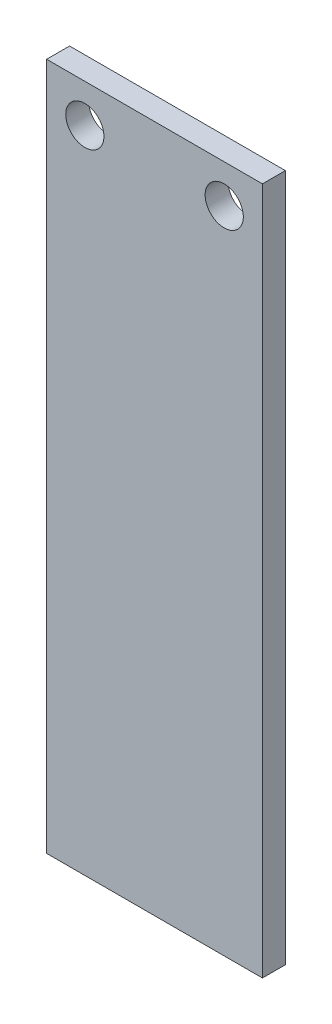
ISO-10303-21;
HEADER;
FILE_DESCRIPTION(('STEP AP214'),'2;1');
FILE_NAME('part.step','',(''),(''),'','','');
FILE_SCHEMA(('AUTOMOTIVE_DESIGN { 1 0 10303 214 1 1 1 1 }'));
ENDSEC;
DATA;
#1=APPLICATION_CONTEXT('core data for automotive mechanical design processes');
#2=APPLICATION_PROTOCOL_DEFINITION('international standard','automotive_design',2000,#1);
#3=PRODUCT_CONTEXT('',#1,'mechanical');
#4=PRODUCT('Part','Part','',(#3));
#5=PRODUCT_RELATED_PRODUCT_CATEGORY('part','',(#4));
#6=PRODUCT_DEFINITION_FORMATION('','',#4);
#7=PRODUCT_DEFINITION_CONTEXT('part definition',#1,'design');
#8=PRODUCT_DEFINITION('design','',#6,#7);
#9=PRODUCT_DEFINITION_SHAPE('','',#8);
#10=(LENGTH_UNIT() NAMED_UNIT(*) SI_UNIT(.MILLI.,.METRE.));
#11=(NAMED_UNIT(*) PLANE_ANGLE_UNIT() SI_UNIT($,.RADIAN.));
#12=(NAMED_UNIT(*) SI_UNIT($,.STERADIAN.) SOLID_ANGLE_UNIT());
#13=UNCERTAINTY_MEASURE_WITH_UNIT(LENGTH_MEASURE(1.E-05),#10,'distance_accuracy_value','');
#14=(GEOMETRIC_REPRESENTATION_CONTEXT(3) GLOBAL_UNCERTAINTY_ASSIGNED_CONTEXT((#13)) GLOBAL_UNIT_ASSIGNED_CONTEXT((#10,
#11,#12)) REPRESENTATION_CONTEXT('',''));
#15=CARTESIAN_POINT('',(0.,0.,0.));
#16=DIRECTION('',(0.,0.,1.));
#17=DIRECTION('',(1.,0.,0.));
#18=AXIS2_PLACEMENT_3D('',#15,#16,#17);
#19=CARTESIAN_POINT('',(14.12,40.,3.));
#20=DIRECTION('',(-1.,0.,0.));
#21=DIRECTION('',(0.,-1.,0.));
#22=AXIS2_PLACEMENT_3D('',#19,#20,#21);
#23=PLANE('',#22);
#24=DIRECTION('',(0.,1.,0.));
#25=VECTOR('',#24,1.);
#26=CARTESIAN_POINT('',(14.12,40.,0.));
#27=LINE('',#26,#25);
#28=CARTESIAN_POINT('',(14.12,-40.,0.));
#29=VERTEX_POINT('',#28);
#30=CARTESIAN_POINT('',(14.12,50.,0.));
#31=VERTEX_POINT('',#30);
#32=EDGE_CURVE('E86',#29,#31,#27,.T.);
#33=ORIENTED_EDGE('',*,*,#32,.T.);
#34=DIRECTION('',(0.,0.,-1.));
#35=VECTOR('',#34,1.);
#36=CARTESIAN_POINT('',(14.12,50.,3.));
#37=LINE('',#36,#35);
#38=CARTESIAN_POINT('',(14.12,50.,3.));
#39=VERTEX_POINT('',#38);
#40=EDGE_CURVE('E88',#39,#31,#37,.T.);
#41=ORIENTED_EDGE('',*,*,#40,.F.);
#42=DIRECTION('',(0.,1.,0.));
#43=VECTOR('',#42,1.);
#44=CARTESIAN_POINT('',(14.12,40.,3.));
#45=LINE('',#44,#43);
#46=CARTESIAN_POINT('',(14.12,-40.,3.));
#47=VERTEX_POINT('',#46);
#48=EDGE_CURVE('E75',#47,#39,#45,.T.);
#49=ORIENTED_EDGE('',*,*,#48,.F.);
#50=DIRECTION('',(0.,0.,-1.));
#51=VECTOR('',#50,1.);
#52=CARTESIAN_POINT('',(14.12,-40.,3.));
#53=LINE('',#52,#51);
#54=EDGE_CURVE('E50',#47,#29,#53,.T.);
#55=ORIENTED_EDGE('',*,*,#54,.T.);
#56=EDGE_LOOP('',(#33,#41,#49,#55));
#57=FACE_BOUND('',#56,.T.);
#58=ADVANCED_FACE('F41',(#57),#23,.F.);
#59=CARTESIAN_POINT('',(-14.12,40.,3.));
#60=DIRECTION('',(1.,0.,0.));
#61=DIRECTION('',(0.,1.,0.));
#62=AXIS2_PLACEMENT_3D('',#59,#60,#61);
#63=PLANE('',#62);
#64=DIRECTION('',(0.,-1.,0.));
#65=VECTOR('',#64,1.);
#66=CARTESIAN_POINT('',(-14.12,40.,0.));
#67=LINE('',#66,#65);
#68=CARTESIAN_POINT('',(-14.12,50.,0.));
#69=VERTEX_POINT('',#68);
#70=CARTESIAN_POINT('',(-14.12,-40.,0.));
#71=VERTEX_POINT('',#70);
#72=EDGE_CURVE('E69',#69,#71,#67,.T.);
#73=ORIENTED_EDGE('',*,*,#72,.T.);
#74=DIRECTION('',(0.,0.,-1.));
#75=VECTOR('',#74,1.);
#76=CARTESIAN_POINT('',(-14.12,-40.,3.));
#77=LINE('',#76,#75);
#78=CARTESIAN_POINT('',(-14.12,-40.,3.));
#79=VERTEX_POINT('',#78);
#80=EDGE_CURVE('E11',#79,#71,#77,.T.);
#81=ORIENTED_EDGE('',*,*,#80,.F.);
#82=DIRECTION('',(0.,-1.,0.));
#83=VECTOR('',#82,1.);
#84=CARTESIAN_POINT('',(-14.12,40.,3.));
#85=LINE('',#84,#83);
#86=CARTESIAN_POINT('',(-14.12,50.,3.));
#87=VERTEX_POINT('',#86);
#88=EDGE_CURVE('E120',#87,#79,#85,.T.);
#89=ORIENTED_EDGE('',*,*,#88,.F.);
#90=DIRECTION('',(0.,0.,-1.));
#91=VECTOR('',#90,1.);
#92=CARTESIAN_POINT('',(-14.12,50.,3.));
#93=LINE('',#92,#91);
#94=EDGE_CURVE('E102',#87,#69,#93,.T.);
#95=ORIENTED_EDGE('',*,*,#94,.T.);
#96=EDGE_LOOP('',(#73,#81,#89,#95));
#97=FACE_BOUND('',#96,.T.);
#98=ADVANCED_FACE('F132',(#97),#63,.F.);
#99=CARTESIAN_POINT('',(-14.12,-40.,3.));
#100=DIRECTION('',(0.,1.,0.));
#101=DIRECTION('',(0.,0.,1.));
#102=AXIS2_PLACEMENT_3D('',#99,#100,#101);
#103=PLANE('',#102);
#104=DIRECTION('',(1.,0.,0.));
#105=VECTOR('',#104,1.);
#106=CARTESIAN_POINT('',(-14.12,-40.,0.));
#107=LINE('',#106,#105);
#108=EDGE_CURVE('E121',#71,#29,#107,.T.);
#109=ORIENTED_EDGE('',*,*,#108,.T.);
#110=ORIENTED_EDGE('',*,*,#54,.F.);
#111=DIRECTION('',(1.,0.,0.));
#112=VECTOR('',#111,1.);
#113=CARTESIAN_POINT('',(-14.12,-40.,3.));
#114=LINE('',#113,#112);
#115=EDGE_CURVE('E58',#79,#47,#114,.T.);
#116=ORIENTED_EDGE('',*,*,#115,.F.);
#117=ORIENTED_EDGE('',*,*,#80,.T.);
#118=EDGE_LOOP('',(#109,#110,#116,#117));
#119=FACE_BOUND('',#118,.T.);
#120=ADVANCED_FACE('F131',(#119),#103,.F.);
#121=CARTESIAN_POINT('',(0.,0.,3.));
#122=DIRECTION('',(0.,0.,1.));
#123=DIRECTION('',(1.,0.,0.));
#124=AXIS2_PLACEMENT_3D('',#121,#122,#123);
#125=PLANE('',#124);
#126=CARTESIAN_POINT('',(9.12,45.,3.));
#127=DIRECTION('',(0.,0.,1.));
#128=DIRECTION('',(1.,0.,0.));
#129=AXIS2_PLACEMENT_3D('',#126,#127,#128);
#130=CIRCLE('',#129,2.5);
#131=CARTESIAN_POINT('',(6.62,45.,3.));
#132=VERTEX_POINT('',#131);
#133=EDGE_CURVE('E218',#132,#132,#130,.T.);
#134=ORIENTED_EDGE('',*,*,#133,.F.);
#135=EDGE_LOOP('',(#134));
#136=FACE_BOUND('',#135,.T.);
#137=CARTESIAN_POINT('',(-9.12,45.,3.));
#138=DIRECTION('',(0.,0.,1.));
#139=DIRECTION('',(1.,0.,0.));
#140=AXIS2_PLACEMENT_3D('',#137,#138,#139);
#141=CIRCLE('',#140,2.5);
#142=CARTESIAN_POINT('',(-11.62,45.,3.));
#143=VERTEX_POINT('',#142);
#144=EDGE_CURVE('E112',#143,#143,#141,.F.);
#145=ORIENTED_EDGE('',*,*,#144,.T.);
#146=EDGE_LOOP('',(#145));
#147=FACE_BOUND('',#146,.T.);
#148=ORIENTED_EDGE('',*,*,#48,.T.);
#149=DIRECTION('',(1.,0.,0.));
#150=VECTOR('',#149,1.);
#151=CARTESIAN_POINT('',(-14.12,50.,3.));
#152=LINE('',#151,#150);
#153=EDGE_CURVE('E100',#87,#39,#152,.T.);
#154=ORIENTED_EDGE('',*,*,#153,.F.);
#155=ORIENTED_EDGE('',*,*,#88,.T.);
#156=ORIENTED_EDGE('',*,*,#115,.T.);
#157=EDGE_LOOP('',(#148,#154,#155,#156));
#158=FACE_BOUND('',#157,.T.);
#159=ADVANCED_FACE('F133',(#136,#147,#158),#125,.T.);
#160=CARTESIAN_POINT('',(0.,0.,0.));
#161=DIRECTION('',(0.,0.,1.));
#162=DIRECTION('',(1.,0.,0.));
#163=AXIS2_PLACEMENT_3D('',#160,#161,#162);
#164=PLANE('',#163);
#165=CARTESIAN_POINT('',(9.12,45.,0.));
#166=DIRECTION('',(0.,0.,1.));
#167=DIRECTION('',(1.,0.,0.));
#168=AXIS2_PLACEMENT_3D('',#165,#166,#167);
#169=CIRCLE('',#168,2.5);
#170=CARTESIAN_POINT('',(6.62,45.,0.));
#171=VERTEX_POINT('',#170);
#172=EDGE_CURVE('E221',#171,#171,#169,.T.);
#173=ORIENTED_EDGE('',*,*,#172,.T.);
#174=EDGE_LOOP('',(#173));
#175=FACE_BOUND('',#174,.T.);
#176=CARTESIAN_POINT('',(-9.12,45.,0.));
#177=DIRECTION('',(0.,0.,-1.));
#178=DIRECTION('',(-1.,0.,0.));
#179=AXIS2_PLACEMENT_3D('',#176,#177,#178);
#180=CIRCLE('',#179,2.5);
#181=CARTESIAN_POINT('',(-11.62,45.,0.));
#182=VERTEX_POINT('',#181);
#183=EDGE_CURVE('E106',#182,#182,#180,.T.);
#184=ORIENTED_EDGE('',*,*,#183,.F.);
#185=EDGE_LOOP('',(#184));
#186=FACE_BOUND('',#185,.T.);
#187=ORIENTED_EDGE('',*,*,#32,.F.);
#188=ORIENTED_EDGE('',*,*,#108,.F.);
#189=ORIENTED_EDGE('',*,*,#72,.F.);
#190=DIRECTION('',(1.,0.,0.));
#191=VECTOR('',#190,1.);
#192=CARTESIAN_POINT('',(-14.12,50.,0.));
#193=LINE('',#192,#191);
#194=EDGE_CURVE('E99',#69,#31,#193,.T.);
#195=ORIENTED_EDGE('',*,*,#194,.T.);
#196=EDGE_LOOP('',(#187,#188,#189,#195));
#197=FACE_BOUND('',#196,.T.);
#198=ADVANCED_FACE('F104',(#175,#186,#197),#164,.F.);
#199=CARTESIAN_POINT('',(-14.12,50.,3.));
#200=DIRECTION('',(0.,1.,0.));
#201=DIRECTION('',(0.,0.,1.));
#202=AXIS2_PLACEMENT_3D('',#199,#200,#201);
#203=PLANE('',#202);
#204=ORIENTED_EDGE('',*,*,#194,.F.);
#205=ORIENTED_EDGE('',*,*,#94,.F.);
#206=ORIENTED_EDGE('',*,*,#153,.T.);
#207=ORIENTED_EDGE('',*,*,#40,.T.);
#208=EDGE_LOOP('',(#204,#205,#206,#207));
#209=FACE_BOUND('',#208,.T.);
#210=ADVANCED_FACE('F97',(#209),#203,.T.);
#211=CARTESIAN_POINT('',(-9.12,45.,3.001));
#212=DIRECTION('',(0.,0.,-1.));
#213=DIRECTION('',(-1.,0.,0.));
#214=AXIS2_PLACEMENT_3D('',#211,#212,#213);
#215=CYLINDRICAL_SURFACE('',#214,2.5);
#216=CARTESIAN_POINT('',(-11.62,45.,3.));
#217=CARTESIAN_POINT('',(-11.62,45.,2.96875));
#218=CARTESIAN_POINT('',(-11.62,45.,2.9375));
#219=CARTESIAN_POINT('',(-11.62,45.,2.875));
#220=CARTESIAN_POINT('',(-11.62,45.,2.84375));
#221=CARTESIAN_POINT('',(-11.62,45.,2.78125));
#222=CARTESIAN_POINT('',(-11.62,45.,2.75));
#223=CARTESIAN_POINT('',(-11.62,45.,2.6875));
#224=CARTESIAN_POINT('',(-11.62,45.,2.65625));
#225=CARTESIAN_POINT('',(-11.62,45.,2.59375));
#226=CARTESIAN_POINT('',(-11.62,45.,2.5625));
#227=CARTESIAN_POINT('',(-11.62,45.,2.5));
#228=CARTESIAN_POINT('',(-11.62,45.,2.46875));
#229=CARTESIAN_POINT('',(-11.62,45.,2.40625));
#230=CARTESIAN_POINT('',(-11.62,45.,2.375));
#231=CARTESIAN_POINT('',(-11.62,45.,2.3125));
#232=CARTESIAN_POINT('',(-11.62,45.,2.28125));
#233=CARTESIAN_POINT('',(-11.62,45.,2.21875));
#234=CARTESIAN_POINT('',(-11.62,45.,2.1875));
#235=CARTESIAN_POINT('',(-11.62,45.,2.125));
#236=CARTESIAN_POINT('',(-11.62,45.,2.09375));
#237=CARTESIAN_POINT('',(-11.62,45.,2.03125));
#238=CARTESIAN_POINT('',(-11.62,45.,2.));
#239=CARTESIAN_POINT('',(-11.62,45.,1.9375));
#240=CARTESIAN_POINT('',(-11.62,45.,1.90625));
#241=CARTESIAN_POINT('',(-11.62,45.,1.84375));
#242=CARTESIAN_POINT('',(-11.62,45.,1.8125));
#243=CARTESIAN_POINT('',(-11.62,45.,1.75));
#244=CARTESIAN_POINT('',(-11.62,45.,1.71875));
#245=CARTESIAN_POINT('',(-11.62,45.,1.65625));
#246=CARTESIAN_POINT('',(-11.62,45.,1.625));
#247=CARTESIAN_POINT('',(-11.62,45.,1.5625));
#248=CARTESIAN_POINT('',(-11.62,45.,1.53125));
#249=CARTESIAN_POINT('',(-11.62,45.,1.46875));
#250=CARTESIAN_POINT('',(-11.62,45.,1.4375));
#251=CARTESIAN_POINT('',(-11.62,45.,1.375));
#252=CARTESIAN_POINT('',(-11.62,45.,1.34375));
#253=CARTESIAN_POINT('',(-11.62,45.,1.28125));
#254=CARTESIAN_POINT('',(-11.62,45.,1.25));
#255=CARTESIAN_POINT('',(-11.62,45.,1.1875));
#256=CARTESIAN_POINT('',(-11.62,45.,1.15625));
#257=CARTESIAN_POINT('',(-11.62,45.,1.09375));
#258=CARTESIAN_POINT('',(-11.62,45.,1.0625));
#259=CARTESIAN_POINT('',(-11.62,45.,1.));
#260=CARTESIAN_POINT('',(-11.62,45.,0.96875));
#261=CARTESIAN_POINT('',(-11.62,45.,0.90625));
#262=CARTESIAN_POINT('',(-11.62,45.,0.875));
#263=CARTESIAN_POINT('',(-11.62,45.,0.8125));
#264=CARTESIAN_POINT('',(-11.62,45.,0.78125));
#265=CARTESIAN_POINT('',(-11.62,45.,0.71875));
#266=CARTESIAN_POINT('',(-11.62,45.,0.6875));
#267=CARTESIAN_POINT('',(-11.62,45.,0.625));
#268=CARTESIAN_POINT('',(-11.62,45.,0.59375));
#269=CARTESIAN_POINT('',(-11.62,45.,0.53125));
#270=CARTESIAN_POINT('',(-11.62,45.,0.5));
#271=CARTESIAN_POINT('',(-11.62,45.,0.4375));
#272=CARTESIAN_POINT('',(-11.62,45.,0.40625));
#273=CARTESIAN_POINT('',(-11.62,45.,0.34375));
#274=CARTESIAN_POINT('',(-11.62,45.,0.3125));
#275=CARTESIAN_POINT('',(-11.62,45.,0.25));
#276=CARTESIAN_POINT('',(-11.62,45.,0.21875));
#277=CARTESIAN_POINT('',(-11.62,45.,0.156250000000001));
#278=CARTESIAN_POINT('',(-11.62,45.,0.125000000000001));
#279=CARTESIAN_POINT('',(-11.62,45.,0.0625000000000005));
#280=CARTESIAN_POINT('',(-11.62,45.,0.0312500000000005));
#281=CARTESIAN_POINT('',(-11.62,45.,0.));
#282=B_SPLINE_CURVE_WITH_KNOTS('',3,(#216,#217,#218,#219,#220,#221,#222,#223,#224,#225,#226,
#227,#228,#229,#230,#231,#232,#233,#234,#235,#236,#237,#238,#239,#240,#241,#242,#243,#244,#245,
#246,#247,#248,#249,#250,#251,#252,#253,#254,#255,#256,#257,#258,#259,#260,#261,#262,#263,#264,
#265,#266,#267,#268,#269,#270,#271,#272,#273,#274,#275,#276,#277,#278,#279,#280,#281),
.UNSPECIFIED.,.F.,.F.,(4,2,2,2,2,2,2,2,2,2,2,2,2,2,2,2,2,2,2,2,2,2,2,2,2,2,2,2,2,2,2,2,4),(0.,
0.0937499999999997,0.1875,0.28125,0.375,0.46875,0.5625,0.65625,0.749999999999999,
0.843749999999999,0.9375,1.03125,1.125,1.21875,1.3125,1.40625,1.5,1.59375,1.6875,1.78125,1.875,
1.96875,2.0625,2.15625,2.25,2.34375,2.4375,2.53125,2.625,2.71875,2.8125,2.90625,3.),.UNSPECIFIED.);
#283=EDGE_CURVE('BSEAM196',#143,#182,#282,.T.);
#284=ORIENTED_EDGE('',*,*,#144,.F.);
#285=ORIENTED_EDGE('',*,*,#183,.T.);
#286=ORIENTED_EDGE('',*,*,#283,.T.);
#287=ORIENTED_EDGE('',*,*,#283,.F.);
#288=EDGE_LOOP('',(#284,#286,#285,#287));
#289=FACE_BOUND('',#288,.T.);
#290=ADVANCED_FACE('F196',(#289),#215,.F.);
#291=CARTESIAN_POINT('',(9.12,45.,3.001));
#292=DIRECTION('',(0.,0.,-1.));
#293=DIRECTION('',(-1.,0.,0.));
#294=AXIS2_PLACEMENT_3D('',#291,#292,#293);
#295=CYLINDRICAL_SURFACE('',#294,2.5);
#296=CARTESIAN_POINT('',(6.62,45.,3.));
#297=CARTESIAN_POINT('',(6.62,45.,2.96875));
#298=CARTESIAN_POINT('',(6.62,45.,2.9375));
#299=CARTESIAN_POINT('',(6.62,45.,2.875));
#300=CARTESIAN_POINT('',(6.62,45.,2.84375));
#301=CARTESIAN_POINT('',(6.62,45.,2.78125));
#302=CARTESIAN_POINT('',(6.62,45.,2.75));
#303=CARTESIAN_POINT('',(6.62,45.,2.6875));
#304=CARTESIAN_POINT('',(6.62,45.,2.65625));
#305=CARTESIAN_POINT('',(6.62,45.,2.59375));
#306=CARTESIAN_POINT('',(6.62,45.,2.5625));
#307=CARTESIAN_POINT('',(6.62,45.,2.5));
#308=CARTESIAN_POINT('',(6.62,45.,2.46875));
#309=CARTESIAN_POINT('',(6.62,45.,2.40625));
#310=CARTESIAN_POINT('',(6.62,45.,2.375));
#311=CARTESIAN_POINT('',(6.62,45.,2.3125));
#312=CARTESIAN_POINT('',(6.62,45.,2.28125));
#313=CARTESIAN_POINT('',(6.62,45.,2.21875));
#314=CARTESIAN_POINT('',(6.62,45.,2.1875));
#315=CARTESIAN_POINT('',(6.62,45.,2.125));
#316=CARTESIAN_POINT('',(6.62,45.,2.09375));
#317=CARTESIAN_POINT('',(6.62,45.,2.03125));
#318=CARTESIAN_POINT('',(6.62,45.,2.));
#319=CARTESIAN_POINT('',(6.62,45.,1.9375));
#320=CARTESIAN_POINT('',(6.62,45.,1.90625));
#321=CARTESIAN_POINT('',(6.62,45.,1.84375));
#322=CARTESIAN_POINT('',(6.62,45.,1.8125));
#323=CARTESIAN_POINT('',(6.62,45.,1.75));
#324=CARTESIAN_POINT('',(6.62,45.,1.71875));
#325=CARTESIAN_POINT('',(6.62,45.,1.65625));
#326=CARTESIAN_POINT('',(6.62,45.,1.625));
#327=CARTESIAN_POINT('',(6.62,45.,1.5625));
#328=CARTESIAN_POINT('',(6.62,45.,1.53125));
#329=CARTESIAN_POINT('',(6.62,45.,1.46875));
#330=CARTESIAN_POINT('',(6.62,45.,1.4375));
#331=CARTESIAN_POINT('',(6.62,45.,1.375));
#332=CARTESIAN_POINT('',(6.62,45.,1.34375));
#333=CARTESIAN_POINT('',(6.62,45.,1.28125));
#334=CARTESIAN_POINT('',(6.62,45.,1.25));
#335=CARTESIAN_POINT('',(6.62,45.,1.1875));
#336=CARTESIAN_POINT('',(6.62,45.,1.15625));
#337=CARTESIAN_POINT('',(6.62,45.,1.09375));
#338=CARTESIAN_POINT('',(6.62,45.,1.0625));
#339=CARTESIAN_POINT('',(6.62,45.,1.));
#340=CARTESIAN_POINT('',(6.62,45.,0.96875));
#341=CARTESIAN_POINT('',(6.62,45.,0.90625));
#342=CARTESIAN_POINT('',(6.62,45.,0.875));
#343=CARTESIAN_POINT('',(6.62,45.,0.8125));
#344=CARTESIAN_POINT('',(6.62,45.,0.78125));
#345=CARTESIAN_POINT('',(6.62,45.,0.71875));
#346=CARTESIAN_POINT('',(6.62,45.,0.6875));
#347=CARTESIAN_POINT('',(6.62,45.,0.625));
#348=CARTESIAN_POINT('',(6.62,45.,0.59375));
#349=CARTESIAN_POINT('',(6.62,45.,0.53125));
#350=CARTESIAN_POINT('',(6.62,45.,0.5));
#351=CARTESIAN_POINT('',(6.62,45.,0.4375));
#352=CARTESIAN_POINT('',(6.62,45.,0.40625));
#353=CARTESIAN_POINT('',(6.62,45.,0.34375));
#354=CARTESIAN_POINT('',(6.62,45.,0.3125));
#355=CARTESIAN_POINT('',(6.62,45.,0.25));
#356=CARTESIAN_POINT('',(6.62,45.,0.21875));
#357=CARTESIAN_POINT('',(6.62,45.,0.15625));
#358=CARTESIAN_POINT('',(6.62,45.,0.125));
#359=CARTESIAN_POINT('',(6.62,45.,0.0624999999999996));
#360=CARTESIAN_POINT('',(6.62,45.,0.0312499999999996));
#361=CARTESIAN_POINT('',(6.62,45.,0.));
#362=B_SPLINE_CURVE_WITH_KNOTS('',3,(#296,#297,#298,#299,#300,#301,#302,#303,#304,#305,#306,
#307,#308,#309,#310,#311,#312,#313,#314,#315,#316,#317,#318,#319,#320,#321,#322,#323,#324,#325,
#326,#327,#328,#329,#330,#331,#332,#333,#334,#335,#336,#337,#338,#339,#340,#341,#342,#343,#344,
#345,#346,#347,#348,#349,#350,#351,#352,#353,#354,#355,#356,#357,#358,#359,#360,#361),
.UNSPECIFIED.,.F.,.F.,(4,2,2,2,2,2,2,2,2,2,2,2,2,2,2,2,2,2,2,2,2,2,2,2,2,2,2,2,2,2,2,2,4),(0.,
0.0937499999999997,0.1875,0.28125,0.375,0.46875,0.5625,0.65625,0.75,0.84375,0.9375,1.03125,
1.125,1.21875,1.3125,1.40625,1.5,1.59375,1.6875,1.78125,1.875,1.96875,2.0625,2.15625,2.25,
2.34375,2.4375,2.53125,2.625,2.71875,2.8125,2.90625,3.),.UNSPECIFIED.);
#363=EDGE_CURVE('BSEAM202',#132,#171,#362,.T.);
#364=ORIENTED_EDGE('',*,*,#133,.T.);
#365=ORIENTED_EDGE('',*,*,#172,.F.);
#366=ORIENTED_EDGE('',*,*,#363,.T.);
#367=ORIENTED_EDGE('',*,*,#363,.F.);
#368=EDGE_LOOP('',(#364,#366,#365,#367));
#369=FACE_BOUND('',#368,.T.);
#370=ADVANCED_FACE('F202',(#369),#295,.F.);
#371=CLOSED_SHELL('',(#58,#98,#120,#159,#198,#210,#290,#370));
#372=MANIFOLD_SOLID_BREP('B2',#371);
#373=ADVANCED_BREP_SHAPE_REPRESENTATION('',(#18,#372),#14);
#374=SHAPE_DEFINITION_REPRESENTATION(#9,#373);
ENDSEC;
END-ISO-10303-21;
